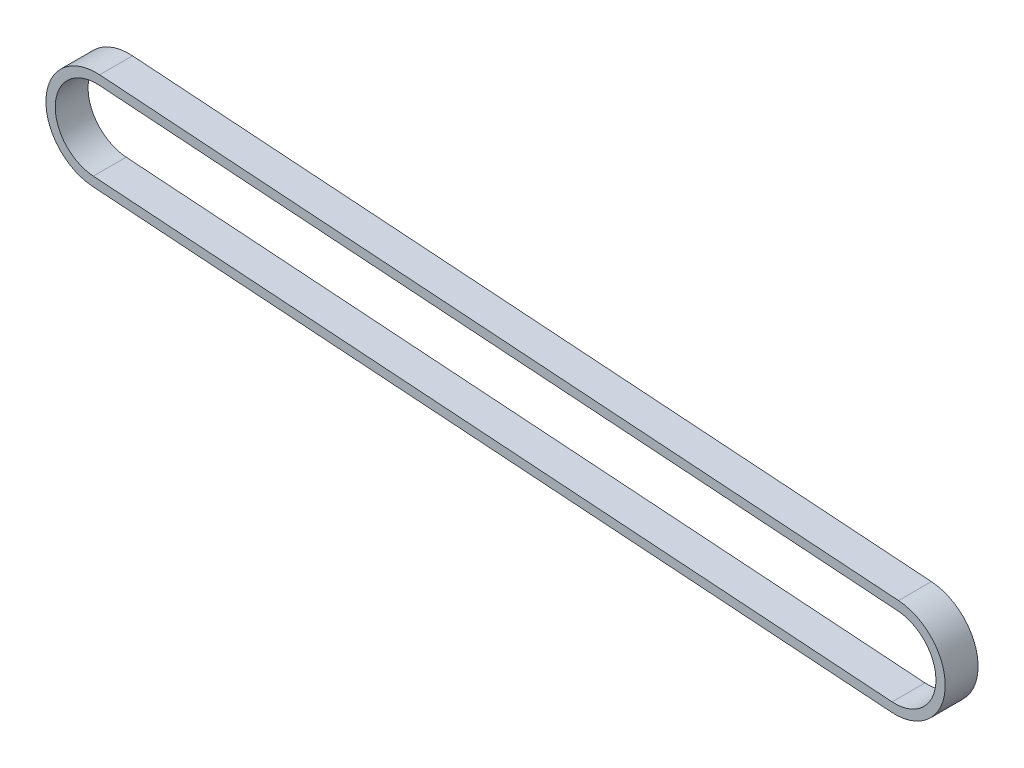
ISO-10303-21;
HEADER;
FILE_DESCRIPTION(('STEP AP214'),'2;1');
FILE_NAME('part.step','',(''),(''),'','','');
FILE_SCHEMA(('AUTOMOTIVE_DESIGN { 1 0 10303 214 1 1 1 1 }'));
ENDSEC;
DATA;
#1=APPLICATION_CONTEXT('core data for automotive mechanical design processes');
#2=APPLICATION_PROTOCOL_DEFINITION('international standard','automotive_design',2000,#1);
#3=PRODUCT_CONTEXT('',#1,'mechanical');
#4=PRODUCT('Part','Part','',(#3));
#5=PRODUCT_RELATED_PRODUCT_CATEGORY('part','',(#4));
#6=PRODUCT_DEFINITION_FORMATION('','',#4);
#7=PRODUCT_DEFINITION_CONTEXT('part definition',#1,'design');
#8=PRODUCT_DEFINITION('design','',#6,#7);
#9=PRODUCT_DEFINITION_SHAPE('','',#8);
#10=(LENGTH_UNIT() NAMED_UNIT(*) SI_UNIT(.MILLI.,.METRE.));
#11=(NAMED_UNIT(*) PLANE_ANGLE_UNIT() SI_UNIT($,.RADIAN.));
#12=(NAMED_UNIT(*) SI_UNIT($,.STERADIAN.) SOLID_ANGLE_UNIT());
#13=UNCERTAINTY_MEASURE_WITH_UNIT(LENGTH_MEASURE(1.E-05),#10,'distance_accuracy_value','');
#14=(GEOMETRIC_REPRESENTATION_CONTEXT(3) GLOBAL_UNCERTAINTY_ASSIGNED_CONTEXT((#13)) GLOBAL_UNIT_ASSIGNED_CONTEXT((#10,
#11,#12)) REPRESENTATION_CONTEXT('',''));
#15=CARTESIAN_POINT('',(0.,0.,0.));
#16=DIRECTION('',(0.,0.,1.));
#17=DIRECTION('',(1.,0.,0.));
#18=AXIS2_PLACEMENT_3D('',#15,#16,#17);
#19=CARTESIAN_POINT('',(0.,0.,9.));
#20=DIRECTION('',(0.,0.,1.));
#21=DIRECTION('',(1.,0.,0.));
#22=AXIS2_PLACEMENT_3D('',#19,#20,#21);
#23=PLANE('',#22);
#24=CARTESIAN_POINT('',(0.,0.,9.));
#25=DIRECTION('',(0.,0.,1.));
#26=DIRECTION('',(1.,0.,0.));
#27=AXIS2_PLACEMENT_3D('',#24,#25,#26);
#28=CIRCLE('',#27,13.7524071575494);
#29=CARTESIAN_POINT('',(0.959884078377047,13.7188674890858,9.));
#30=VERTEX_POINT('',#29);
#31=CARTESIAN_POINT('',(-0.959884078376964,-13.7188674890858,9.));
#32=VERTEX_POINT('',#31);
#33=EDGE_CURVE('E159',#30,#32,#28,.T.);
#34=ORIENTED_EDGE('',*,*,#33,.T.);
#35=DIRECTION('',(0.997561178339225,-0.0697975319797069,0.));
#36=VECTOR('',#35,1.);
#37=CARTESIAN_POINT('',(-0.959884078376964,-13.7188674890858,9.));
#38=LINE('',#37,#36);
#39=CARTESIAN_POINT('',(217.774698955864,-29.0233263893585,9.));
#40=VERTEX_POINT('',#39);
#41=EDGE_CURVE('E162',#32,#40,#38,.T.);
#42=ORIENTED_EDGE('',*,*,#41,.T.);
#43=CARTESIAN_POINT('',(218.734583034241,-15.3044589002727,9.));
#44=DIRECTION('',(0.,0.,1.));
#45=DIRECTION('',(1.,0.,0.));
#46=AXIS2_PLACEMENT_3D('',#43,#44,#45);
#47=CIRCLE('',#46,13.7524071575494);
#48=CARTESIAN_POINT('',(219.694467112618,-1.58559141118691,9.));
#49=VERTEX_POINT('',#48);
#50=EDGE_CURVE('E165',#40,#49,#47,.T.);
#51=ORIENTED_EDGE('',*,*,#50,.T.);
#52=DIRECTION('',(-0.997561178339225,0.0697975319797069,0.));
#53=VECTOR('',#52,1.);
#54=CARTESIAN_POINT('',(0.959884078377047,13.7188674890858,9.));
#55=LINE('',#54,#53);
#56=EDGE_CURVE('E167',#49,#30,#55,.T.);
#57=ORIENTED_EDGE('',*,*,#56,.T.);
#58=EDGE_LOOP('',(#34,#42,#51,#57));
#59=FACE_BOUND('',#58,.T.);
#60=DIRECTION('',(0.997561178339225,-0.0697975319797069,0.));
#61=VECTOR('',#60,1.);
#62=CARTESIAN_POINT('',(-0.782598347148509,-11.1850620961042,9.));
#63=LINE('',#62,#61);
#64=CARTESIAN_POINT('',(-0.782598347148509,-11.1850620961042,9.));
#65=VERTEX_POINT('',#64);
#66=CARTESIAN_POINT('',(217.951984687092,-26.4895209963769,9.));
#67=VERTEX_POINT('',#66);
#68=EDGE_CURVE('E131',#65,#67,#63,.T.);
#69=ORIENTED_EDGE('',*,*,#68,.F.);
#70=CARTESIAN_POINT('',(0.,0.,9.));
#71=DIRECTION('',(0.,0.,1.));
#72=DIRECTION('',(1.,0.,0.));
#73=AXIS2_PLACEMENT_3D('',#70,#71,#72);
#74=CIRCLE('',#73,11.2124071575494);
#75=CARTESIAN_POINT('',(0.782598347148592,11.1850620961042,9.));
#76=VERTEX_POINT('',#75);
#77=EDGE_CURVE('E123',#76,#65,#74,.T.);
#78=ORIENTED_EDGE('',*,*,#77,.F.);
#79=DIRECTION('',(-0.997561178339224,0.0697975319797069,0.));
#80=VECTOR('',#79,1.);
#81=CARTESIAN_POINT('',(0.782598347148592,11.1850620961042,9.));
#82=LINE('',#81,#80);
#83=CARTESIAN_POINT('',(219.51718138139,-4.11939680416855,9.));
#84=VERTEX_POINT('',#83);
#85=EDGE_CURVE('E145',#84,#76,#82,.T.);
#86=ORIENTED_EDGE('',*,*,#85,.F.);
#87=CARTESIAN_POINT('',(218.734583034241,-15.3044589002727,9.));
#88=DIRECTION('',(0.,0.,1.));
#89=DIRECTION('',(1.,0.,0.));
#90=AXIS2_PLACEMENT_3D('',#87,#88,#89);
#91=CIRCLE('',#90,11.2124071575494);
#92=EDGE_CURVE('E143',#67,#84,#91,.T.);
#93=ORIENTED_EDGE('',*,*,#92,.F.);
#94=EDGE_LOOP('',(#69,#78,#86,#93));
#95=FACE_BOUND('',#94,.T.);
#96=ADVANCED_FACE('F58',(#59,#95),#23,.T.);
#97=CARTESIAN_POINT('',(0.,0.,0.));
#98=DIRECTION('',(0.,0.,1.));
#99=DIRECTION('',(1.,0.,0.));
#100=AXIS2_PLACEMENT_3D('',#97,#98,#99);
#101=PLANE('',#100);
#102=CARTESIAN_POINT('',(0.,0.,0.));
#103=DIRECTION('',(0.,0.,1.));
#104=DIRECTION('',(1.,0.,0.));
#105=AXIS2_PLACEMENT_3D('',#102,#103,#104);
#106=CIRCLE('',#105,13.7524071575494);
#107=CARTESIAN_POINT('',(0.959884078377047,13.7188674890858,0.));
#108=VERTEX_POINT('',#107);
#109=CARTESIAN_POINT('',(-0.959884078376964,-13.7188674890858,0.));
#110=VERTEX_POINT('',#109);
#111=EDGE_CURVE('E139',#108,#110,#106,.T.);
#112=ORIENTED_EDGE('',*,*,#111,.F.);
#113=DIRECTION('',(-0.997561178339225,0.0697975319797069,0.));
#114=VECTOR('',#113,1.);
#115=CARTESIAN_POINT('',(0.959884078377047,13.7188674890858,0.));
#116=LINE('',#115,#114);
#117=CARTESIAN_POINT('',(219.694467112618,-1.58559141118691,0.));
#118=VERTEX_POINT('',#117);
#119=EDGE_CURVE('E163',#118,#108,#116,.T.);
#120=ORIENTED_EDGE('',*,*,#119,.F.);
#121=CARTESIAN_POINT('',(218.734583034241,-15.3044589002727,0.));
#122=DIRECTION('',(0.,0.,1.));
#123=DIRECTION('',(1.,0.,0.));
#124=AXIS2_PLACEMENT_3D('',#121,#122,#123);
#125=CIRCLE('',#124,13.7524071575494);
#126=CARTESIAN_POINT('',(217.774698955864,-29.0233263893585,0.));
#127=VERTEX_POINT('',#126);
#128=EDGE_CURVE('E174',#127,#118,#125,.T.);
#129=ORIENTED_EDGE('',*,*,#128,.F.);
#130=DIRECTION('',(0.997561178339225,-0.0697975319797069,0.));
#131=VECTOR('',#130,1.);
#132=CARTESIAN_POINT('',(-0.959884078376964,-13.7188674890858,0.));
#133=LINE('',#132,#131);
#134=EDGE_CURVE('E172',#110,#127,#133,.T.);
#135=ORIENTED_EDGE('',*,*,#134,.F.);
#136=EDGE_LOOP('',(#112,#120,#129,#135));
#137=FACE_BOUND('',#136,.T.);
#138=CARTESIAN_POINT('',(0.,0.,0.));
#139=DIRECTION('',(0.,0.,1.));
#140=DIRECTION('',(1.,0.,0.));
#141=AXIS2_PLACEMENT_3D('',#138,#139,#140);
#142=CIRCLE('',#141,11.2124071575494);
#143=CARTESIAN_POINT('',(0.782598347148592,11.1850620961042,0.));
#144=VERTEX_POINT('',#143);
#145=CARTESIAN_POINT('',(-0.782598347148509,-11.1850620961042,0.));
#146=VERTEX_POINT('',#145);
#147=EDGE_CURVE('E81',#144,#146,#142,.T.);
#148=ORIENTED_EDGE('',*,*,#147,.T.);
#149=DIRECTION('',(0.997561178339225,-0.0697975319797069,0.));
#150=VECTOR('',#149,1.);
#151=CARTESIAN_POINT('',(-0.782598347148509,-11.1850620961042,0.));
#152=LINE('',#151,#150);
#153=CARTESIAN_POINT('',(217.951984687092,-26.4895209963769,0.));
#154=VERTEX_POINT('',#153);
#155=EDGE_CURVE('E138',#146,#154,#152,.T.);
#156=ORIENTED_EDGE('',*,*,#155,.T.);
#157=CARTESIAN_POINT('',(218.734583034241,-15.3044589002727,0.));
#158=DIRECTION('',(0.,0.,1.));
#159=DIRECTION('',(1.,0.,0.));
#160=AXIS2_PLACEMENT_3D('',#157,#158,#159);
#161=CIRCLE('',#160,11.2124071575494);
#162=CARTESIAN_POINT('',(219.51718138139,-4.11939680416855,0.));
#163=VERTEX_POINT('',#162);
#164=EDGE_CURVE('E151',#154,#163,#161,.T.);
#165=ORIENTED_EDGE('',*,*,#164,.T.);
#166=DIRECTION('',(-0.997561178339224,0.0697975319797069,0.));
#167=VECTOR('',#166,1.);
#168=CARTESIAN_POINT('',(0.782598347148592,11.1850620961042,0.));
#169=LINE('',#168,#167);
#170=EDGE_CURVE('E132',#163,#144,#169,.T.);
#171=ORIENTED_EDGE('',*,*,#170,.T.);
#172=EDGE_LOOP('',(#148,#156,#165,#171));
#173=FACE_BOUND('',#172,.T.);
#174=ADVANCED_FACE('F192',(#137,#173),#101,.F.);
#175=CARTESIAN_POINT('',(0.,0.,9.));
#176=DIRECTION('',(0.,0.,-1.));
#177=DIRECTION('',(-1.,0.,0.));
#178=AXIS2_PLACEMENT_3D('',#175,#176,#177);
#179=CYLINDRICAL_SURFACE('',#178,13.7524071575494);
#180=ORIENTED_EDGE('',*,*,#111,.T.);
#181=DIRECTION('',(0.,0.,-1.));
#182=VECTOR('',#181,1.);
#183=CARTESIAN_POINT('',(-0.959884078376964,-13.7188674890858,9.));
#184=LINE('',#183,#182);
#185=EDGE_CURVE('E12',#32,#110,#184,.T.);
#186=ORIENTED_EDGE('',*,*,#185,.F.);
#187=ORIENTED_EDGE('',*,*,#33,.F.);
#188=DIRECTION('',(0.,0.,-1.));
#189=VECTOR('',#188,1.);
#190=CARTESIAN_POINT('',(0.959884078377047,13.7188674890858,9.));
#191=LINE('',#190,#189);
#192=EDGE_CURVE('E169',#30,#108,#191,.T.);
#193=ORIENTED_EDGE('',*,*,#192,.T.);
#194=EDGE_LOOP('',(#180,#186,#187,#193));
#195=FACE_BOUND('',#194,.T.);
#196=ADVANCED_FACE('F60',(#195),#179,.T.);
#197=CARTESIAN_POINT('',(-0.959884078376964,-13.7188674890858,9.));
#198=DIRECTION('',(0.0697975319797068,0.997561178339224,0.));
#199=DIRECTION('',(-0.997561178339225,0.0697975319797069,0.));
#200=AXIS2_PLACEMENT_3D('',#197,#198,#199);
#201=PLANE('',#200);
#202=ORIENTED_EDGE('',*,*,#134,.T.);
#203=DIRECTION('',(0.,0.,-1.));
#204=VECTOR('',#203,1.);
#205=CARTESIAN_POINT('',(217.774698955864,-29.0233263893585,9.));
#206=LINE('',#205,#204);
#207=EDGE_CURVE('E66',#40,#127,#206,.T.);
#208=ORIENTED_EDGE('',*,*,#207,.F.);
#209=ORIENTED_EDGE('',*,*,#41,.F.);
#210=ORIENTED_EDGE('',*,*,#185,.T.);
#211=EDGE_LOOP('',(#202,#208,#209,#210));
#212=FACE_BOUND('',#211,.T.);
#213=ADVANCED_FACE('F202',(#212),#201,.F.);
#214=CARTESIAN_POINT('',(218.734583034241,-15.3044589002727,9.));
#215=DIRECTION('',(0.,0.,-1.));
#216=DIRECTION('',(-1.,0.,0.));
#217=AXIS2_PLACEMENT_3D('',#214,#215,#216);
#218=CYLINDRICAL_SURFACE('',#217,13.7524071575494);
#219=ORIENTED_EDGE('',*,*,#128,.T.);
#220=DIRECTION('',(0.,0.,-1.));
#221=VECTOR('',#220,1.);
#222=CARTESIAN_POINT('',(219.694467112618,-1.58559141118691,9.));
#223=LINE('',#222,#221);
#224=EDGE_CURVE('E179',#49,#118,#223,.T.);
#225=ORIENTED_EDGE('',*,*,#224,.F.);
#226=ORIENTED_EDGE('',*,*,#50,.F.);
#227=ORIENTED_EDGE('',*,*,#207,.T.);
#228=EDGE_LOOP('',(#219,#225,#226,#227));
#229=FACE_BOUND('',#228,.T.);
#230=ADVANCED_FACE('F186',(#229),#218,.T.);
#231=CARTESIAN_POINT('',(0.959884078377047,13.7188674890858,9.));
#232=DIRECTION('',(-0.0697975319797068,-0.997561178339224,0.));
#233=DIRECTION('',(0.997561178339225,-0.0697975319797069,0.));
#234=AXIS2_PLACEMENT_3D('',#231,#232,#233);
#235=PLANE('',#234);
#236=ORIENTED_EDGE('',*,*,#119,.T.);
#237=ORIENTED_EDGE('',*,*,#192,.F.);
#238=ORIENTED_EDGE('',*,*,#56,.F.);
#239=ORIENTED_EDGE('',*,*,#224,.T.);
#240=EDGE_LOOP('',(#236,#237,#238,#239));
#241=FACE_BOUND('',#240,.T.);
#242=ADVANCED_FACE('F196',(#241),#235,.F.);
#243=CARTESIAN_POINT('',(0.,0.,9.));
#244=DIRECTION('',(0.,0.,-1.));
#245=DIRECTION('',(-1.,0.,0.));
#246=AXIS2_PLACEMENT_3D('',#243,#244,#245);
#247=CYLINDRICAL_SURFACE('',#246,11.2124071575494);
#248=ORIENTED_EDGE('',*,*,#147,.F.);
#249=DIRECTION('',(0.,0.,-1.));
#250=VECTOR('',#249,1.);
#251=CARTESIAN_POINT('',(0.782598347148592,11.1850620961042,9.));
#252=LINE('',#251,#250);
#253=EDGE_CURVE('E127',#76,#144,#252,.T.);
#254=ORIENTED_EDGE('',*,*,#253,.F.);
#255=ORIENTED_EDGE('',*,*,#77,.T.);
#256=DIRECTION('',(0.,0.,-1.));
#257=VECTOR('',#256,1.);
#258=CARTESIAN_POINT('',(-0.782598347148509,-11.1850620961042,9.));
#259=LINE('',#258,#257);
#260=EDGE_CURVE('E126',#65,#146,#259,.T.);
#261=ORIENTED_EDGE('',*,*,#260,.T.);
#262=EDGE_LOOP('',(#248,#254,#255,#261));
#263=FACE_BOUND('',#262,.T.);
#264=ADVANCED_FACE('F125',(#263),#247,.F.);
#265=CARTESIAN_POINT('',(-0.782598347148509,-11.1850620961042,9.));
#266=DIRECTION('',(0.0697975319797068,0.997561178339224,0.));
#267=DIRECTION('',(-0.997561178339225,0.0697975319797069,0.));
#268=AXIS2_PLACEMENT_3D('',#265,#266,#267);
#269=PLANE('',#268);
#270=ORIENTED_EDGE('',*,*,#155,.F.);
#271=ORIENTED_EDGE('',*,*,#260,.F.);
#272=ORIENTED_EDGE('',*,*,#68,.T.);
#273=DIRECTION('',(0.,0.,-1.));
#274=VECTOR('',#273,1.);
#275=CARTESIAN_POINT('',(217.951984687092,-26.4895209963769,9.));
#276=LINE('',#275,#274);
#277=EDGE_CURVE('E140',#67,#154,#276,.T.);
#278=ORIENTED_EDGE('',*,*,#277,.T.);
#279=EDGE_LOOP('',(#270,#271,#272,#278));
#280=FACE_BOUND('',#279,.T.);
#281=ADVANCED_FACE('F135',(#280),#269,.T.);
#282=CARTESIAN_POINT('',(218.734583034241,-15.3044589002727,9.));
#283=DIRECTION('',(0.,0.,-1.));
#284=DIRECTION('',(-1.,0.,0.));
#285=AXIS2_PLACEMENT_3D('',#282,#283,#284);
#286=CYLINDRICAL_SURFACE('',#285,11.2124071575494);
#287=ORIENTED_EDGE('',*,*,#164,.F.);
#288=ORIENTED_EDGE('',*,*,#277,.F.);
#289=ORIENTED_EDGE('',*,*,#92,.T.);
#290=DIRECTION('',(0.,0.,-1.));
#291=VECTOR('',#290,1.);
#292=CARTESIAN_POINT('',(219.51718138139,-4.11939680416855,9.));
#293=LINE('',#292,#291);
#294=EDGE_CURVE('E73',#84,#163,#293,.T.);
#295=ORIENTED_EDGE('',*,*,#294,.T.);
#296=EDGE_LOOP('',(#287,#288,#289,#295));
#297=FACE_BOUND('',#296,.T.);
#298=ADVANCED_FACE('F225',(#297),#286,.F.);
#299=CARTESIAN_POINT('',(0.782598347148592,11.1850620961042,9.));
#300=DIRECTION('',(-0.0697975319797068,-0.997561178339224,0.));
#301=DIRECTION('',(0.997561178339225,-0.0697975319797069,0.));
#302=AXIS2_PLACEMENT_3D('',#299,#300,#301);
#303=PLANE('',#302);
#304=ORIENTED_EDGE('',*,*,#170,.F.);
#305=ORIENTED_EDGE('',*,*,#294,.F.);
#306=ORIENTED_EDGE('',*,*,#85,.T.);
#307=ORIENTED_EDGE('',*,*,#253,.T.);
#308=EDGE_LOOP('',(#304,#305,#306,#307));
#309=FACE_BOUND('',#308,.T.);
#310=ADVANCED_FACE('F229',(#309),#303,.T.);
#311=CLOSED_SHELL('',(#96,#174,#196,#213,#230,#242,#264,#281,#298,#310));
#312=MANIFOLD_SOLID_BREP('B2',#311);
#313=ADVANCED_BREP_SHAPE_REPRESENTATION('',(#18,#312),#14);
#314=SHAPE_DEFINITION_REPRESENTATION(#9,#313);
ENDSEC;
END-ISO-10303-21;
